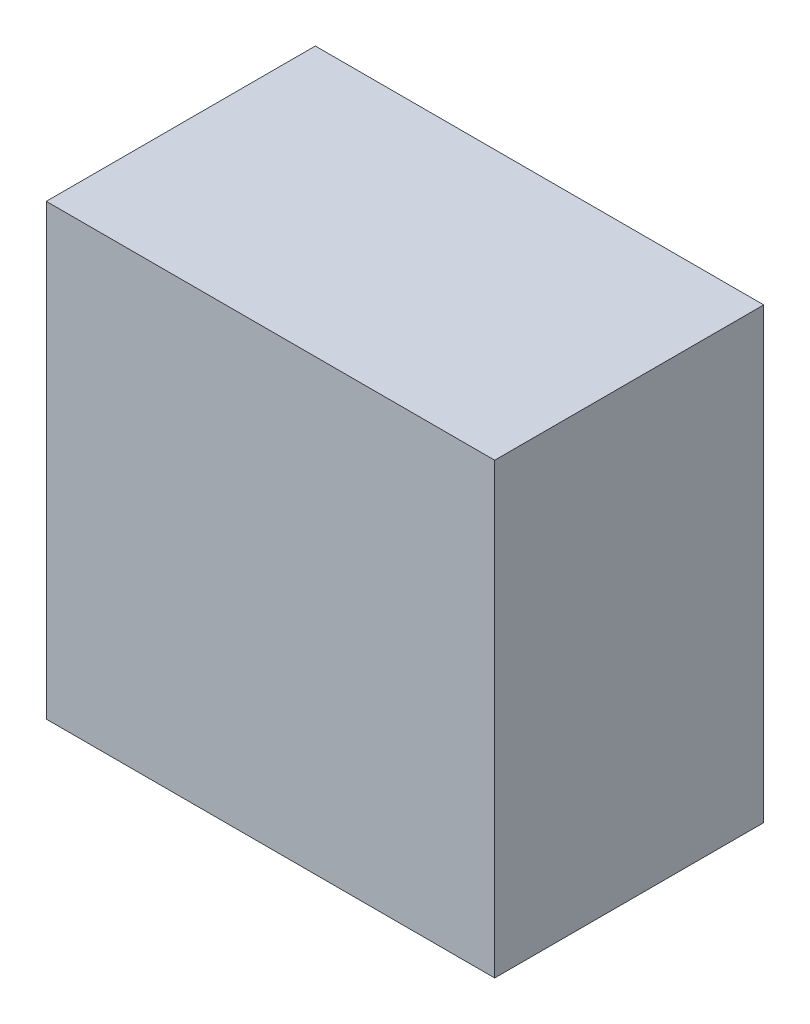
ISO-10303-21;
HEADER;
FILE_DESCRIPTION(('STEP AP214'),'2;1');
FILE_NAME('part.step','',(''),(''),'','','');
FILE_SCHEMA(('AUTOMOTIVE_DESIGN { 1 0 10303 214 1 1 1 1 }'));
ENDSEC;
DATA;
#1=APPLICATION_CONTEXT('core data for automotive mechanical design processes');
#2=APPLICATION_PROTOCOL_DEFINITION('international standard','automotive_design',2000,#1);
#3=PRODUCT_CONTEXT('',#1,'mechanical');
#4=PRODUCT('Part','Part','',(#3));
#5=PRODUCT_RELATED_PRODUCT_CATEGORY('part','',(#4));
#6=PRODUCT_DEFINITION_FORMATION('','',#4);
#7=PRODUCT_DEFINITION_CONTEXT('part definition',#1,'design');
#8=PRODUCT_DEFINITION('design','',#6,#7);
#9=PRODUCT_DEFINITION_SHAPE('','',#8);
#10=(LENGTH_UNIT() NAMED_UNIT(*) SI_UNIT(.MILLI.,.METRE.));
#11=(NAMED_UNIT(*) PLANE_ANGLE_UNIT() SI_UNIT($,.RADIAN.));
#12=(NAMED_UNIT(*) SI_UNIT($,.STERADIAN.) SOLID_ANGLE_UNIT());
#13=UNCERTAINTY_MEASURE_WITH_UNIT(LENGTH_MEASURE(1.E-05),#10,'distance_accuracy_value','');
#14=(GEOMETRIC_REPRESENTATION_CONTEXT(3) GLOBAL_UNCERTAINTY_ASSIGNED_CONTEXT((#13)) GLOBAL_UNIT_ASSIGNED_CONTEXT((#10,
#11,#12)) REPRESENTATION_CONTEXT('',''));
#15=CARTESIAN_POINT('',(0.,0.,0.));
#16=DIRECTION('',(0.,0.,1.));
#17=DIRECTION('',(1.,0.,0.));
#18=AXIS2_PLACEMENT_3D('',#15,#16,#17);
#19=CARTESIAN_POINT('',(75.,-75.,90.));
#20=DIRECTION('',(-1.,0.,0.));
#21=DIRECTION('',(0.,0.,1.));
#22=AXIS2_PLACEMENT_3D('',#19,#20,#21);
#23=PLANE('',#22);
#24=DIRECTION('',(0.,1.,0.));
#25=VECTOR('',#24,1.);
#26=CARTESIAN_POINT('',(75.,-75.,0.));
#27=LINE('',#26,#25);
#28=CARTESIAN_POINT('',(75.,-75.,0.));
#29=VERTEX_POINT('',#28);
#30=CARTESIAN_POINT('',(75.,75.,0.));
#31=VERTEX_POINT('',#30);
#32=EDGE_CURVE('E95',#29,#31,#27,.T.);
#33=ORIENTED_EDGE('',*,*,#32,.T.);
#34=DIRECTION('',(0.,0.,-1.));
#35=VECTOR('',#34,1.);
#36=CARTESIAN_POINT('',(75.,75.,90.));
#37=LINE('',#36,#35);
#38=CARTESIAN_POINT('',(75.,75.,90.));
#39=VERTEX_POINT('',#38);
#40=EDGE_CURVE('E11',#39,#31,#37,.T.);
#41=ORIENTED_EDGE('',*,*,#40,.F.);
#42=DIRECTION('',(0.,1.,0.));
#43=VECTOR('',#42,1.);
#44=CARTESIAN_POINT('',(75.,-75.,90.));
#45=LINE('',#44,#43);
#46=CARTESIAN_POINT('',(75.,-75.,90.));
#47=VERTEX_POINT('',#46);
#48=EDGE_CURVE('E83',#47,#39,#45,.T.);
#49=ORIENTED_EDGE('',*,*,#48,.F.);
#50=DIRECTION('',(0.,0.,-1.));
#51=VECTOR('',#50,1.);
#52=CARTESIAN_POINT('',(75.,-75.,90.));
#53=LINE('',#52,#51);
#54=EDGE_CURVE('E91',#47,#29,#53,.T.);
#55=ORIENTED_EDGE('',*,*,#54,.T.);
#56=EDGE_LOOP('',(#33,#41,#49,#55));
#57=FACE_BOUND('',#56,.T.);
#58=ADVANCED_FACE('F32',(#57),#23,.F.);
#59=CARTESIAN_POINT('',(-75.,75.,90.));
#60=DIRECTION('',(0.,-1.,0.));
#61=DIRECTION('',(0.,0.,-1.));
#62=AXIS2_PLACEMENT_3D('',#59,#60,#61);
#63=PLANE('',#62);
#64=DIRECTION('',(-1.,0.,0.));
#65=VECTOR('',#64,1.);
#66=CARTESIAN_POINT('',(-75.,75.,0.));
#67=LINE('',#66,#65);
#68=CARTESIAN_POINT('',(-75.,75.,0.));
#69=VERTEX_POINT('',#68);
#70=EDGE_CURVE('E87',#31,#69,#67,.T.);
#71=ORIENTED_EDGE('',*,*,#70,.T.);
#72=DIRECTION('',(0.,0.,-1.));
#73=VECTOR('',#72,1.);
#74=CARTESIAN_POINT('',(-75.,75.,90.));
#75=LINE('',#74,#73);
#76=CARTESIAN_POINT('',(-75.,75.,90.));
#77=VERTEX_POINT('',#76);
#78=EDGE_CURVE('E40',#77,#69,#75,.T.);
#79=ORIENTED_EDGE('',*,*,#78,.F.);
#80=DIRECTION('',(-1.,0.,0.));
#81=VECTOR('',#80,1.);
#82=CARTESIAN_POINT('',(-75.,75.,90.));
#83=LINE('',#82,#81);
#84=EDGE_CURVE('E78',#39,#77,#83,.T.);
#85=ORIENTED_EDGE('',*,*,#84,.F.);
#86=ORIENTED_EDGE('',*,*,#40,.T.);
#87=EDGE_LOOP('',(#71,#79,#85,#86));
#88=FACE_BOUND('',#87,.T.);
#89=ADVANCED_FACE('F86',(#88),#63,.F.);
#90=CARTESIAN_POINT('',(-75.,-75.,90.));
#91=DIRECTION('',(1.,0.,0.));
#92=DIRECTION('',(0.,0.,-1.));
#93=AXIS2_PLACEMENT_3D('',#90,#91,#92);
#94=PLANE('',#93);
#95=DIRECTION('',(0.,-1.,0.));
#96=VECTOR('',#95,1.);
#97=CARTESIAN_POINT('',(-75.,-75.,0.));
#98=LINE('',#97,#96);
#99=CARTESIAN_POINT('',(-75.,-75.,0.));
#100=VERTEX_POINT('',#99);
#101=EDGE_CURVE('E65',#69,#100,#98,.T.);
#102=ORIENTED_EDGE('',*,*,#101,.T.);
#103=DIRECTION('',(0.,0.,-1.));
#104=VECTOR('',#103,1.);
#105=CARTESIAN_POINT('',(-75.,-75.,90.));
#106=LINE('',#105,#104);
#107=CARTESIAN_POINT('',(-75.,-75.,90.));
#108=VERTEX_POINT('',#107);
#109=EDGE_CURVE('E88',#108,#100,#106,.T.);
#110=ORIENTED_EDGE('',*,*,#109,.F.);
#111=DIRECTION('',(0.,-1.,0.));
#112=VECTOR('',#111,1.);
#113=CARTESIAN_POINT('',(-75.,-75.,90.));
#114=LINE('',#113,#112);
#115=EDGE_CURVE('E81',#77,#108,#114,.T.);
#116=ORIENTED_EDGE('',*,*,#115,.F.);
#117=ORIENTED_EDGE('',*,*,#78,.T.);
#118=EDGE_LOOP('',(#102,#110,#116,#117));
#119=FACE_BOUND('',#118,.T.);
#120=ADVANCED_FACE('F89',(#119),#94,.F.);
#121=CARTESIAN_POINT('',(-75.,-75.,90.));
#122=DIRECTION('',(0.,1.,0.));
#123=DIRECTION('',(0.,0.,1.));
#124=AXIS2_PLACEMENT_3D('',#121,#122,#123);
#125=PLANE('',#124);
#126=DIRECTION('',(1.,0.,0.));
#127=VECTOR('',#126,1.);
#128=CARTESIAN_POINT('',(-75.,-75.,0.));
#129=LINE('',#128,#127);
#130=EDGE_CURVE('E71',#100,#29,#129,.T.);
#131=ORIENTED_EDGE('',*,*,#130,.T.);
#132=ORIENTED_EDGE('',*,*,#54,.F.);
#133=DIRECTION('',(1.,0.,0.));
#134=VECTOR('',#133,1.);
#135=CARTESIAN_POINT('',(-75.,-75.,90.));
#136=LINE('',#135,#134);
#137=EDGE_CURVE('E48',#108,#47,#136,.T.);
#138=ORIENTED_EDGE('',*,*,#137,.F.);
#139=ORIENTED_EDGE('',*,*,#109,.T.);
#140=EDGE_LOOP('',(#131,#132,#138,#139));
#141=FACE_BOUND('',#140,.T.);
#142=ADVANCED_FACE('F102',(#141),#125,.F.);
#143=CARTESIAN_POINT('',(0.,0.,90.));
#144=DIRECTION('',(0.,0.,-1.));
#145=DIRECTION('',(-1.,0.,0.));
#146=AXIS2_PLACEMENT_3D('',#143,#144,#145);
#147=PLANE('',#146);
#148=ORIENTED_EDGE('',*,*,#48,.T.);
#149=ORIENTED_EDGE('',*,*,#84,.T.);
#150=ORIENTED_EDGE('',*,*,#115,.T.);
#151=ORIENTED_EDGE('',*,*,#137,.T.);
#152=EDGE_LOOP('',(#148,#149,#150,#151));
#153=FACE_BOUND('',#152,.T.);
#154=ADVANCED_FACE('F79',(#153),#147,.F.);
#155=CARTESIAN_POINT('',(0.,0.,0.));
#156=DIRECTION('',(0.,0.,-1.));
#157=DIRECTION('',(-1.,0.,0.));
#158=AXIS2_PLACEMENT_3D('',#155,#156,#157);
#159=PLANE('',#158);
#160=ORIENTED_EDGE('',*,*,#32,.F.);
#161=ORIENTED_EDGE('',*,*,#130,.F.);
#162=ORIENTED_EDGE('',*,*,#101,.F.);
#163=ORIENTED_EDGE('',*,*,#70,.F.);
#164=EDGE_LOOP('',(#160,#161,#162,#163));
#165=FACE_BOUND('',#164,.T.);
#166=ADVANCED_FACE('F105',(#165),#159,.T.);
#167=CLOSED_SHELL('',(#58,#89,#120,#142,#154,#166));
#168=MANIFOLD_SOLID_BREP('B2',#167);
#169=ADVANCED_BREP_SHAPE_REPRESENTATION('',(#18,#168),#14);
#170=SHAPE_DEFINITION_REPRESENTATION(#9,#169);
ENDSEC;
END-ISO-10303-21;
